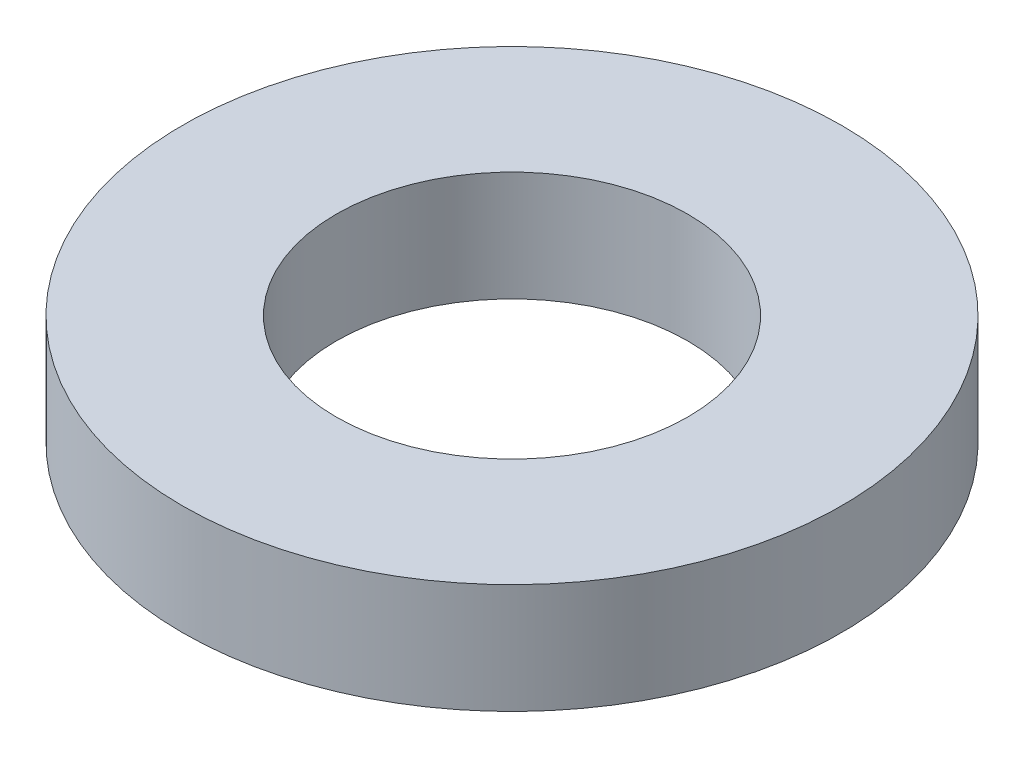
ISO-10303-21;
HEADER;
FILE_DESCRIPTION(('STEP AP214'),'2;1');
FILE_NAME('part.step','',(''),(''),'','','');
FILE_SCHEMA(('AUTOMOTIVE_DESIGN { 1 0 10303 214 1 1 1 1 }'));
ENDSEC;
DATA;
#1=APPLICATION_CONTEXT('core data for automotive mechanical design processes');
#2=APPLICATION_PROTOCOL_DEFINITION('international standard','automotive_design',2000,#1);
#3=PRODUCT_CONTEXT('',#1,'mechanical');
#4=PRODUCT('Part','Part','',(#3));
#5=PRODUCT_RELATED_PRODUCT_CATEGORY('part','',(#4));
#6=PRODUCT_DEFINITION_FORMATION('','',#4);
#7=PRODUCT_DEFINITION_CONTEXT('part definition',#1,'design');
#8=PRODUCT_DEFINITION('design','',#6,#7);
#9=PRODUCT_DEFINITION_SHAPE('','',#8);
#10=(LENGTH_UNIT() NAMED_UNIT(*) SI_UNIT(.MILLI.,.METRE.));
#11=(NAMED_UNIT(*) PLANE_ANGLE_UNIT() SI_UNIT($,.RADIAN.));
#12=(NAMED_UNIT(*) SI_UNIT($,.STERADIAN.) SOLID_ANGLE_UNIT());
#13=UNCERTAINTY_MEASURE_WITH_UNIT(LENGTH_MEASURE(1.E-05),#10,'distance_accuracy_value','');
#14=(GEOMETRIC_REPRESENTATION_CONTEXT(3) GLOBAL_UNCERTAINTY_ASSIGNED_CONTEXT((#13)) GLOBAL_UNIT_ASSIGNED_CONTEXT((#10,
#11,#12)) REPRESENTATION_CONTEXT('',''));
#15=CARTESIAN_POINT('',(0.,0.,0.));
#16=DIRECTION('',(0.,0.,1.));
#17=DIRECTION('',(1.,0.,0.));
#18=AXIS2_PLACEMENT_3D('',#15,#16,#17);
#19=CARTESIAN_POINT('',(0.,1.5875,0.));
#20=DIRECTION('',(0.,1.,0.));
#21=DIRECTION('',(0.,0.,1.));
#22=AXIS2_PLACEMENT_3D('',#19,#20,#21);
#23=PLANE('',#22);
#24=CARTESIAN_POINT('',(0.,1.5875,0.));
#25=DIRECTION('',(0.,1.,0.));
#26=DIRECTION('',(0.,0.,1.));
#27=AXIS2_PLACEMENT_3D('',#24,#25,#26);
#28=CIRCLE('',#27,4.7625);
#29=CARTESIAN_POINT('',(0.,1.5875,4.7625));
#30=VERTEX_POINT('',#29);
#31=EDGE_CURVE('E10',#30,#30,#28,.T.);
#32=ORIENTED_EDGE('',*,*,#31,.T.);
#33=EDGE_LOOP('',(#32));
#34=FACE_BOUND('',#33,.T.);
#35=CARTESIAN_POINT('',(0.,1.5875,0.));
#36=DIRECTION('',(0.,1.,0.));
#37=DIRECTION('',(0.,0.,1.));
#38=AXIS2_PLACEMENT_3D('',#35,#36,#37);
#39=CIRCLE('',#38,2.54);
#40=CARTESIAN_POINT('',(0.,1.5875,2.54));
#41=VERTEX_POINT('',#40);
#42=EDGE_CURVE('E49',#41,#41,#39,.T.);
#43=ORIENTED_EDGE('',*,*,#42,.F.);
#44=EDGE_LOOP('',(#43));
#45=FACE_BOUND('',#44,.T.);
#46=ADVANCED_FACE('F39',(#34,#45),#23,.T.);
#47=CARTESIAN_POINT('',(0.,0.,0.));
#48=DIRECTION('',(0.,1.,0.));
#49=DIRECTION('',(0.,0.,1.));
#50=AXIS2_PLACEMENT_3D('',#47,#48,#49);
#51=PLANE('',#50);
#52=CARTESIAN_POINT('',(0.,0.,0.));
#53=DIRECTION('',(0.,1.,0.));
#54=DIRECTION('',(0.,0.,1.));
#55=AXIS2_PLACEMENT_3D('',#52,#53,#54);
#56=CIRCLE('',#55,4.7625);
#57=CARTESIAN_POINT('',(0.,0.,4.7625));
#58=VERTEX_POINT('',#57);
#59=EDGE_CURVE('E43',#58,#58,#56,.T.);
#60=ORIENTED_EDGE('',*,*,#59,.F.);
#61=EDGE_LOOP('',(#60));
#62=FACE_BOUND('',#61,.T.);
#63=CARTESIAN_POINT('',(0.,0.,0.));
#64=DIRECTION('',(0.,1.,0.));
#65=DIRECTION('',(0.,0.,1.));
#66=AXIS2_PLACEMENT_3D('',#63,#64,#65);
#67=CIRCLE('',#66,2.54);
#68=CARTESIAN_POINT('',(0.,0.,2.54));
#69=VERTEX_POINT('',#68);
#70=EDGE_CURVE('E55',#69,#69,#67,.T.);
#71=ORIENTED_EDGE('',*,*,#70,.T.);
#72=EDGE_LOOP('',(#71));
#73=FACE_BOUND('',#72,.T.);
#74=ADVANCED_FACE('F65',(#62,#73),#51,.F.);
#75=CARTESIAN_POINT('',(0.,1.5875,0.));
#76=DIRECTION('',(0.,-1.,0.));
#77=DIRECTION('',(0.,0.,-1.));
#78=AXIS2_PLACEMENT_3D('',#75,#76,#77);
#79=CYLINDRICAL_SURFACE('',#78,4.7625);
#80=ORIENTED_EDGE('',*,*,#31,.F.);
#81=EDGE_LOOP('',(#80));
#82=FACE_BOUND('',#81,.T.);
#83=ORIENTED_EDGE('',*,*,#59,.T.);
#84=EDGE_LOOP('',(#83));
#85=FACE_BOUND('',#84,.T.);
#86=ADVANCED_FACE('F41',(#82,#85),#79,.T.);
#87=CARTESIAN_POINT('',(0.,1.5875,0.));
#88=DIRECTION('',(0.,-1.,0.));
#89=DIRECTION('',(0.,0.,-1.));
#90=AXIS2_PLACEMENT_3D('',#87,#88,#89);
#91=CYLINDRICAL_SURFACE('',#90,2.54);
#92=ORIENTED_EDGE('',*,*,#42,.T.);
#93=EDGE_LOOP('',(#92));
#94=FACE_BOUND('',#93,.T.);
#95=ORIENTED_EDGE('',*,*,#70,.F.);
#96=EDGE_LOOP('',(#95));
#97=FACE_BOUND('',#96,.T.);
#98=ADVANCED_FACE('F59',(#94,#97),#91,.F.);
#99=CLOSED_SHELL('',(#46,#74,#86,#98));
#100=MANIFOLD_SOLID_BREP('B2',#99);
#101=ADVANCED_BREP_SHAPE_REPRESENTATION('',(#18,#100),#14);
#102=SHAPE_DEFINITION_REPRESENTATION(#9,#101);
ENDSEC;
END-ISO-10303-21;
